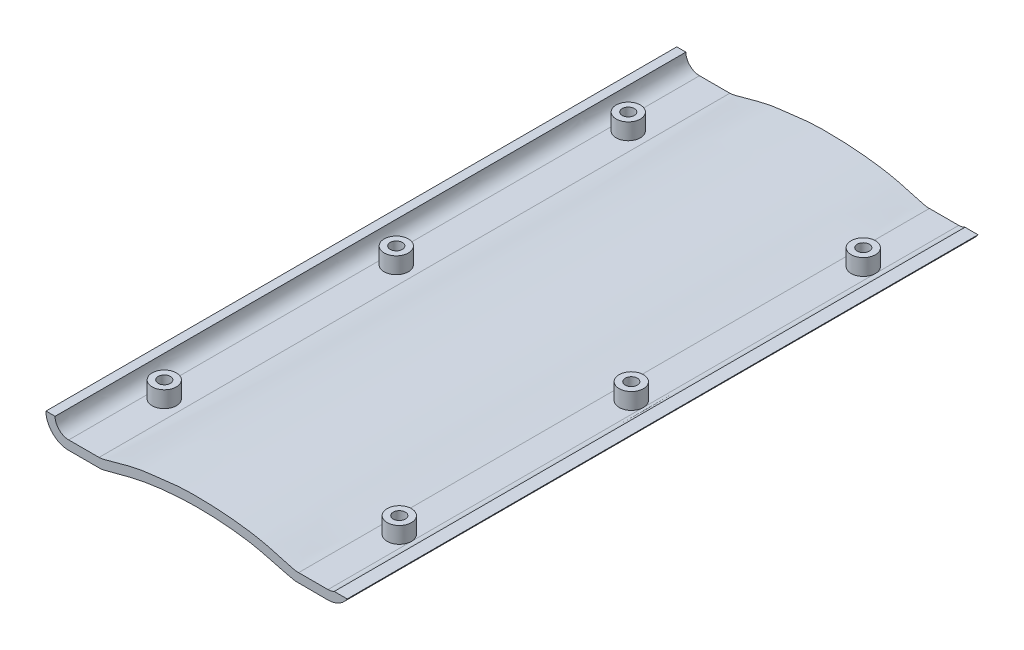
ISO-10303-21;
HEADER;
FILE_DESCRIPTION(('STEP AP214'),'2;1');
FILE_NAME('part.step','',(''),(''),'','','');
FILE_SCHEMA(('AUTOMOTIVE_DESIGN { 1 0 10303 214 1 1 1 1 }'));
ENDSEC;
DATA;
#1=APPLICATION_CONTEXT('core data for automotive mechanical design processes');
#2=APPLICATION_PROTOCOL_DEFINITION('international standard','automotive_design',2000,#1);
#3=PRODUCT_CONTEXT('',#1,'mechanical');
#4=PRODUCT('Part','Part','',(#3));
#5=PRODUCT_RELATED_PRODUCT_CATEGORY('part','',(#4));
#6=PRODUCT_DEFINITION_FORMATION('','',#4);
#7=PRODUCT_DEFINITION_CONTEXT('part definition',#1,'design');
#8=PRODUCT_DEFINITION('design','',#6,#7);
#9=PRODUCT_DEFINITION_SHAPE('','',#8);
#10=(LENGTH_UNIT() NAMED_UNIT(*) SI_UNIT(.MILLI.,.METRE.));
#11=(NAMED_UNIT(*) PLANE_ANGLE_UNIT() SI_UNIT($,.RADIAN.));
#12=(NAMED_UNIT(*) SI_UNIT($,.STERADIAN.) SOLID_ANGLE_UNIT());
#13=UNCERTAINTY_MEASURE_WITH_UNIT(LENGTH_MEASURE(1.E-05),#10,'distance_accuracy_value','');
#14=(GEOMETRIC_REPRESENTATION_CONTEXT(3) GLOBAL_UNCERTAINTY_ASSIGNED_CONTEXT((#13)) GLOBAL_UNIT_ASSIGNED_CONTEXT((#10,
#11,#12)) REPRESENTATION_CONTEXT('',''));
#15=CARTESIAN_POINT('',(0.,0.,0.));
#16=DIRECTION('',(0.,0.,1.));
#17=DIRECTION('',(1.,0.,0.));
#18=AXIS2_PLACEMENT_3D('',#15,#16,#17);
#19=CARTESIAN_POINT('',(31.7868567502551,38.1969713193044,104.));
#20=CARTESIAN_POINT('',(30.8156765561506,37.7005095783258,104.));
#21=CARTESIAN_POINT('',(29.7249650731608,37.6968942297724,104.));
#22=B_SPLINE_CURVE_WITH_KNOTS('',2,(#19,#20,#21),.UNSPECIFIED.,.F.,.F.,(3,3),(0.,1.),.UNSPECIFIED.);
#23=DIRECTION('',(0.,0.,-1.));
#24=VECTOR('',#23,1.);
#25=SURFACE_OF_LINEAR_EXTRUSION('',#22,#24);
#26=CARTESIAN_POINT('',(29.7249650731608,37.6968942297724,-76.0985447829219));
#27=CARTESIAN_POINT('',(29.7384295899145,37.6969670761466,-76.2323631886146));
#28=CARTESIAN_POINT('',(29.7451618482914,37.6970034993337,-76.3661815943073));
#29=CARTESIAN_POINT('',(29.7451618482914,37.6970034993337,-76.6338184056927));
#30=CARTESIAN_POINT('',(29.7384295899145,37.6969670761466,-76.7676368113854));
#31=CARTESIAN_POINT('',(29.7249650731608,37.6968942297724,-76.9014552170781));
#32=B_SPLINE_CURVE_WITH_KNOTS('',3,(#26,#27,#28,#29,#30,#31),.UNSPECIFIED.,.F.,.F.,(4,2,4),(0.,
0.401962949766164,0.803925899532329),.UNSPECIFIED.);
#33=CARTESIAN_POINT('',(29.7249650731608,37.6968942297724,-76.0985447829219));
#34=VERTEX_POINT('',#33);
#35=CARTESIAN_POINT('',(29.7249650731608,37.6968942297723,-76.9014552170781));
#36=VERTEX_POINT('',#35);
#37=EDGE_CURVE('E39',#34,#36,#32,.T.);
#38=ORIENTED_EDGE('',*,*,#37,.F.);
#39=DIRECTION('',(0.,0.,-1.));
#40=VECTOR('',#39,1.);
#41=CARTESIAN_POINT('',(29.7249650731608,37.6968942297723,104.));
#42=LINE('',#41,#40);
#43=CARTESIAN_POINT('',(29.7249650731608,37.6968942297723,-0.401455217078069));
#44=VERTEX_POINT('',#43);
#45=EDGE_CURVE('E68',#44,#34,#42,.T.);
#46=ORIENTED_EDGE('',*,*,#45,.F.);
#47=CARTESIAN_POINT('',(29.7249650731608,37.6968942297724,0.401455217078073));
#48=CARTESIAN_POINT('',(29.7384295899145,37.6969670761466,0.267636811385382));
#49=CARTESIAN_POINT('',(29.7451618482914,37.6970034993337,0.133818405692691));
#50=CARTESIAN_POINT('',(29.7451618482914,37.6970034993337,-0.133818405692691));
#51=CARTESIAN_POINT('',(29.7384295899145,37.6969670761466,-0.267636811385382));
#52=CARTESIAN_POINT('',(29.7249650731608,37.6968942297724,-0.401455217078073));
#53=B_SPLINE_CURVE_WITH_KNOTS('',3,(#47,#48,#49,#50,#51,#52),.UNSPECIFIED.,.F.,.F.,(4,2,4),(0.,
0.401962949766164,0.803925899532329),.UNSPECIFIED.);
#54=CARTESIAN_POINT('',(29.7249650731608,37.6968942297724,0.401455217078069));
#55=VERTEX_POINT('',#54);
#56=EDGE_CURVE('E430',#55,#44,#53,.T.);
#57=ORIENTED_EDGE('',*,*,#56,.F.);
#58=CARTESIAN_POINT('',(29.7249650731608,37.6968942297723,76.0985447829219));
#59=VERTEX_POINT('',#58);
#60=EDGE_CURVE('E72',#59,#55,#42,.T.);
#61=ORIENTED_EDGE('',*,*,#60,.F.);
#62=CARTESIAN_POINT('',(29.7249650731608,37.6968942297724,76.9014552170781));
#63=CARTESIAN_POINT('',(29.7384295899145,37.6969670761466,76.7676368113854));
#64=CARTESIAN_POINT('',(29.7451618482914,37.6970034993337,76.6338184056927));
#65=CARTESIAN_POINT('',(29.7451618482914,37.6970034993337,76.3661815943073));
#66=CARTESIAN_POINT('',(29.7384295899145,37.6969670761466,76.2323631886146));
#67=CARTESIAN_POINT('',(29.7249650731608,37.6968942297724,76.0985447829219));
#68=B_SPLINE_CURVE_WITH_KNOTS('',3,(#62,#63,#64,#65,#66,#67),.UNSPECIFIED.,.F.,.F.,(4,2,4),(0.,
0.401962949766164,0.803925899532329),.UNSPECIFIED.);
#69=CARTESIAN_POINT('',(29.7249650731608,37.6968942297724,76.9014552170781));
#70=VERTEX_POINT('',#69);
#71=EDGE_CURVE('E213',#70,#59,#68,.T.);
#72=ORIENTED_EDGE('',*,*,#71,.F.);
#73=CARTESIAN_POINT('',(29.7249650731608,37.6968942297723,104.));
#74=VERTEX_POINT('',#73);
#75=EDGE_CURVE('E79',#74,#70,#42,.T.);
#76=ORIENTED_EDGE('',*,*,#75,.F.);
#77=CARTESIAN_POINT('',(31.7868567502551,38.1969713193044,104.));
#78=VERTEX_POINT('',#77);
#79=EDGE_CURVE('E461',#78,#74,#22,.T.);
#80=ORIENTED_EDGE('',*,*,#79,.F.);
#81=DIRECTION('',(0.,0.,-1.));
#82=VECTOR('',#81,1.);
#83=CARTESIAN_POINT('',(31.7868567502551,38.1969713193044,104.));
#84=LINE('',#83,#82);
#85=CARTESIAN_POINT('',(31.7868567502551,38.1969713193044,-104.));
#86=VERTEX_POINT('',#85);
#87=EDGE_CURVE('E192',#78,#86,#84,.T.);
#88=ORIENTED_EDGE('',*,*,#87,.T.);
#89=CARTESIAN_POINT('',(31.7868567502551,38.1969713193044,-104.));
#90=CARTESIAN_POINT('',(30.8156765561506,37.7005095783258,-104.));
#91=CARTESIAN_POINT('',(29.7249650731608,37.6968942297724,-104.));
#92=B_SPLINE_CURVE_WITH_KNOTS('',2,(#89,#90,#91),.UNSPECIFIED.,.F.,.F.,(3,3),(0.,1.),.UNSPECIFIED.);
#93=CARTESIAN_POINT('',(29.7249650731608,37.6968942297723,-104.));
#94=VERTEX_POINT('',#93);
#95=EDGE_CURVE('E317',#86,#94,#92,.T.);
#96=ORIENTED_EDGE('',*,*,#95,.T.);
#97=EDGE_CURVE('E190',#36,#94,#42,.T.);
#98=ORIENTED_EDGE('',*,*,#97,.F.);
#99=EDGE_LOOP('',(#38,#46,#57,#61,#72,#76,#80,#88,#96,#98));
#100=FACE_BOUND('',#99,.T.);
#101=ADVANCED_FACE('F34',(#100),#25,.F.);
#102=CARTESIAN_POINT('',(-63.2548381517086,42.1968942285586,104.));
#103=CARTESIAN_POINT('',(-63.3682731197305,38.1655138912871,104.));
#104=CARTESIAN_POINT('',(-59.7511975840646,34.5967600730582,104.));
#105=CARTESIAN_POINT('',(-55.7548381518025,34.6968942297724,104.));
#106=B_SPLINE_CURVE_WITH_KNOTS('',3,(#102,#103,#104,#105),.UNSPECIFIED.,.F.,.F.,(4,4),(0.,1.),.UNSPECIFIED.);
#107=DIRECTION('',(0.,0.,-1.));
#108=VECTOR('',#107,1.);
#109=SURFACE_OF_LINEAR_EXTRUSION('',#106,#108);
#110=CARTESIAN_POINT('',(-63.2548381517086,42.1968942285586,-104.));
#111=CARTESIAN_POINT('',(-63.3682731197305,38.1655138912871,-104.));
#112=CARTESIAN_POINT('',(-59.7511975840646,34.5967600730582,-104.));
#113=CARTESIAN_POINT('',(-55.7548381518025,34.6968942297724,-104.));
#114=B_SPLINE_CURVE_WITH_KNOTS('',3,(#110,#111,#112,#113),.UNSPECIFIED.,.F.,.F.,(4,4),(0.,1.),.UNSPECIFIED.);
#115=CARTESIAN_POINT('',(-63.2548381517086,42.1968942285586,-104.));
#116=VERTEX_POINT('',#115);
#117=CARTESIAN_POINT('',(-55.7548381518025,34.6968942297724,-104.));
#118=VERTEX_POINT('',#117);
#119=EDGE_CURVE('E288',#116,#118,#114,.T.);
#120=ORIENTED_EDGE('',*,*,#119,.T.);
#121=DIRECTION('',(0.,0.,-1.));
#122=VECTOR('',#121,1.);
#123=CARTESIAN_POINT('',(-55.7548381518025,34.6968942297724,104.));
#124=LINE('',#123,#122);
#125=CARTESIAN_POINT('',(-55.7548381518025,34.6968942297724,104.));
#126=VERTEX_POINT('',#125);
#127=EDGE_CURVE('E207',#126,#118,#124,.T.);
#128=ORIENTED_EDGE('',*,*,#127,.F.);
#129=CARTESIAN_POINT('',(-63.2548381517086,42.1968942285586,104.));
#130=VERTEX_POINT('',#129);
#131=EDGE_CURVE('E345',#130,#126,#106,.T.);
#132=ORIENTED_EDGE('',*,*,#131,.F.);
#133=DIRECTION('',(0.,0.,-1.));
#134=VECTOR('',#133,1.);
#135=CARTESIAN_POINT('',(-63.2548381517086,42.1968942285586,104.));
#136=LINE('',#135,#134);
#137=EDGE_CURVE('E287',#130,#116,#136,.T.);
#138=ORIENTED_EDGE('',*,*,#137,.T.);
#139=EDGE_LOOP('',(#120,#128,#132,#138));
#140=FACE_BOUND('',#139,.T.);
#141=ADVANCED_FACE('F36',(#140),#109,.F.);
#142=CARTESIAN_POINT('',(-45.7548381517778,34.6968942297724,104.));
#143=DIRECTION('',(0.,1.,0.));
#144=DIRECTION('',(0.,0.,1.));
#145=AXIS2_PLACEMENT_3D('',#142,#143,#144);
#146=PLANE('',#145);
#147=CARTESIAN_POINT('',(-51.7548381517086,34.6968942297724,-76.5));
#148=DIRECTION('',(0.,1.,0.));
#149=DIRECTION('',(0.,0.,1.));
#150=AXIS2_PLACEMENT_3D('',#147,#148,#149);
#151=CIRCLE('',#150,2.);
#152=CARTESIAN_POINT('',(-51.7548381517086,34.6968942297724,-74.5));
#153=VERTEX_POINT('',#152);
#154=EDGE_CURVE('E540',#153,#153,#151,.T.);
#155=ORIENTED_EDGE('',*,*,#154,.T.);
#156=EDGE_LOOP('',(#155));
#157=FACE_BOUND('',#156,.T.);
#158=CARTESIAN_POINT('',(-51.7548381517086,34.6968942297724,0.));
#159=DIRECTION('',(0.,1.,0.));
#160=DIRECTION('',(0.,0.,1.));
#161=AXIS2_PLACEMENT_3D('',#158,#159,#160);
#162=CIRCLE('',#161,2.);
#163=CARTESIAN_POINT('',(-51.7548381517086,34.6968942297724,2.));
#164=VERTEX_POINT('',#163);
#165=EDGE_CURVE('E542',#164,#164,#162,.T.);
#166=ORIENTED_EDGE('',*,*,#165,.T.);
#167=EDGE_LOOP('',(#166));
#168=FACE_BOUND('',#167,.T.);
#169=CARTESIAN_POINT('',(-51.7548381517086,34.6968942297724,76.5));
#170=DIRECTION('',(0.,1.,0.));
#171=DIRECTION('',(0.,0.,1.));
#172=AXIS2_PLACEMENT_3D('',#169,#170,#171);
#173=CIRCLE('',#172,2.);
#174=CARTESIAN_POINT('',(-51.7548381517086,34.6968942297724,78.5));
#175=VERTEX_POINT('',#174);
#176=EDGE_CURVE('E547',#175,#175,#173,.T.);
#177=ORIENTED_EDGE('',*,*,#176,.T.);
#178=EDGE_LOOP('',(#177));
#179=FACE_BOUND('',#178,.T.);
#180=DIRECTION('',(1.,0.,0.));
#181=VECTOR('',#180,1.);
#182=CARTESIAN_POINT('',(-45.7548381517778,34.6968942297724,-104.));
#183=LINE('',#182,#181);
#184=CARTESIAN_POINT('',(-45.7548381517778,34.6968942297724,-104.));
#185=VERTEX_POINT('',#184);
#186=EDGE_CURVE('E293',#118,#185,#183,.T.);
#187=ORIENTED_EDGE('',*,*,#186,.T.);
#188=DIRECTION('',(0.,0.,-1.));
#189=VECTOR('',#188,1.);
#190=CARTESIAN_POINT('',(-45.7548381517778,34.6968942297724,104.));
#191=LINE('',#190,#189);
#192=CARTESIAN_POINT('',(-45.7548381517778,34.6968942297724,104.));
#193=VERTEX_POINT('',#192);
#194=EDGE_CURVE('E204',#193,#185,#191,.T.);
#195=ORIENTED_EDGE('',*,*,#194,.F.);
#196=DIRECTION('',(1.,0.,0.));
#197=VECTOR('',#196,1.);
#198=CARTESIAN_POINT('',(-45.7548381517778,34.6968942297724,104.));
#199=LINE('',#198,#197);
#200=EDGE_CURVE('E363',#126,#193,#199,.T.);
#201=ORIENTED_EDGE('',*,*,#200,.F.);
#202=ORIENTED_EDGE('',*,*,#127,.T.);
#203=EDGE_LOOP('',(#187,#195,#201,#202));
#204=FACE_BOUND('',#203,.T.);
#205=ADVANCED_FACE('F361',(#157,#168,#179,#204),#146,.F.);
#206=CARTESIAN_POINT('',(-45.7548381517778,34.6968942297724,104.));
#207=CARTESIAN_POINT('',(-44.6527947260766,34.6892445201621,104.));
#208=CARTESIAN_POINT('',(-41.8389101223905,35.4462593092921,104.));
#209=CARTESIAN_POINT('',(-36.7312855970934,36.8985012917322,104.));
#210=CARTESIAN_POINT('',(-30.3957952210604,38.3186380740379,104.));
#211=CARTESIAN_POINT('',(-22.2736868344942,39.3548223637903,104.));
#212=CARTESIAN_POINT('',(-13.0130739206246,39.8467470631081,104.));
#213=CARTESIAN_POINT('',(-3.43676950092065,39.320018707114,104.));
#214=CARTESIAN_POINT('',(7.29004413609731,37.9924631725361,104.));
#215=CARTESIAN_POINT('',(14.2379198839206,35.6752289256719,104.));
#216=CARTESIAN_POINT('',(18.8514683989212,34.7479343319048,104.));
#217=B_SPLINE_CURVE_WITH_KNOTS('',3,(#206,#207,#208,#209,#210,#211,#212,#213,#214,#215,#216),
.UNSPECIFIED.,.F.,.F.,(4,1,1,1,1,1,1,1,4),(0.,0.050080657421666,0.132344158491837,
0.243528070798206,0.346436055537385,0.506687838619731,0.666939621702403,0.784747440190989,1.),.UNSPECIFIED.);
#218=DIRECTION('',(0.,0.,-1.));
#219=VECTOR('',#218,1.);
#220=SURFACE_OF_LINEAR_EXTRUSION('',#217,#219);
#221=CARTESIAN_POINT('',(-45.7548381517778,34.6968942297724,-104.));
#222=CARTESIAN_POINT('',(-44.6527947260766,34.6892445201621,-104.));
#223=CARTESIAN_POINT('',(-41.8389101223905,35.4462593092921,-104.));
#224=CARTESIAN_POINT('',(-36.7312855970934,36.8985012917322,-104.));
#225=CARTESIAN_POINT('',(-30.3957952210604,38.3186380740379,-104.));
#226=CARTESIAN_POINT('',(-22.2736868344942,39.3548223637903,-104.));
#227=CARTESIAN_POINT('',(-13.0130739206246,39.8467470631081,-104.));
#228=CARTESIAN_POINT('',(-3.43676950092065,39.320018707114,-104.));
#229=CARTESIAN_POINT('',(7.29004413609731,37.9924631725361,-104.));
#230=CARTESIAN_POINT('',(14.2379198839206,35.6752289256719,-104.));
#231=CARTESIAN_POINT('',(18.8514683989212,34.7479343319048,-104.));
#232=B_SPLINE_CURVE_WITH_KNOTS('',3,(#221,#222,#223,#224,#225,#226,#227,#228,#229,#230,#231),
.UNSPECIFIED.,.F.,.F.,(4,1,1,1,1,1,1,1,4),(0.,0.050080657421666,0.132344158491837,
0.243528070798206,0.346436055537385,0.506687838619731,0.666939621702403,0.784747440190989,1.),.UNSPECIFIED.);
#233=CARTESIAN_POINT('',(18.8514683989212,34.7479343319048,-104.));
#234=VERTEX_POINT('',#233);
#235=EDGE_CURVE('E299',#185,#234,#232,.T.);
#236=ORIENTED_EDGE('',*,*,#235,.T.);
#237=DIRECTION('',(0.,0.,-1.));
#238=VECTOR('',#237,1.);
#239=CARTESIAN_POINT('',(18.8514683989212,34.7479343319048,104.));
#240=LINE('',#239,#238);
#241=CARTESIAN_POINT('',(18.8514683989212,34.7479343319048,104.));
#242=VERTEX_POINT('',#241);
#243=EDGE_CURVE('E201',#242,#234,#240,.T.);
#244=ORIENTED_EDGE('',*,*,#243,.F.);
#245=EDGE_CURVE('E365',#193,#242,#217,.T.);
#246=ORIENTED_EDGE('',*,*,#245,.F.);
#247=ORIENTED_EDGE('',*,*,#194,.T.);
#248=EDGE_LOOP('',(#236,#244,#246,#247));
#249=FACE_BOUND('',#248,.T.);
#250=ADVANCED_FACE('F387',(#249),#220,.F.);
#251=CARTESIAN_POINT('',(18.8514683989212,34.7479343319048,104.));
#252=DIRECTION('',(0.00469393993781579,0.999988983403247,0.));
#253=DIRECTION('',(-0.999988983403248,0.00469393993781579,0.));
#254=AXIS2_PLACEMENT_3D('',#251,#252,#253);
#255=PLANE('',#254);
#256=CARTESIAN_POINT('',(25.7451618482914,34.7155753924184,76.5));
#257=DIRECTION('',(0.00469393993781579,0.999988983403247,0.));
#258=DIRECTION('',(-0.999988983403248,0.00469393993781579,0.));
#259=AXIS2_PLACEMENT_3D('',#256,#257,#258);
#260=ELLIPSE('',#259,2.00002203343624,2.);
#261=CARTESIAN_POINT('',(23.7451618482914,34.7249633757176,76.5));
#262=VERTEX_POINT('',#261);
#263=EDGE_CURVE('E522',#262,#262,#260,.T.);
#264=ORIENTED_EDGE('',*,*,#263,.T.);
#265=EDGE_LOOP('',(#264));
#266=FACE_BOUND('',#265,.T.);
#267=CARTESIAN_POINT('',(25.7451618482914,34.7155753924184,0.));
#268=DIRECTION('',(0.00469393993781579,0.999988983403247,0.));
#269=DIRECTION('',(-0.999988983403248,0.00469393993781579,0.));
#270=AXIS2_PLACEMENT_3D('',#267,#268,#269);
#271=ELLIPSE('',#270,2.00002203343624,2.);
#272=CARTESIAN_POINT('',(23.7451618482914,34.7249633757176,0.));
#273=VERTEX_POINT('',#272);
#274=EDGE_CURVE('E526',#273,#273,#271,.T.);
#275=ORIENTED_EDGE('',*,*,#274,.T.);
#276=EDGE_LOOP('',(#275));
#277=FACE_BOUND('',#276,.T.);
#278=CARTESIAN_POINT('',(25.7451618482914,34.7155753924184,-76.5));
#279=DIRECTION('',(0.00469393993781579,0.999988983403247,0.));
#280=DIRECTION('',(-0.999988983403248,0.00469393993781579,0.));
#281=AXIS2_PLACEMENT_3D('',#278,#279,#280);
#282=ELLIPSE('',#281,2.00002203343624,2.);
#283=CARTESIAN_POINT('',(23.7451618482914,34.7249633757176,-76.5));
#284=VERTEX_POINT('',#283);
#285=EDGE_CURVE('E529',#284,#284,#282,.T.);
#286=ORIENTED_EDGE('',*,*,#285,.T.);
#287=EDGE_LOOP('',(#286));
#288=FACE_BOUND('',#287,.T.);
#289=DIRECTION('',(0.999988983403247,-0.00469393993781579,0.));
#290=VECTOR('',#289,1.);
#291=CARTESIAN_POINT('',(18.8514683989212,34.7479343319048,-104.));
#292=LINE('',#291,#290);
#293=CARTESIAN_POINT('',(29.7249650731217,34.6968942293138,-104.));
#294=VERTEX_POINT('',#293);
#295=EDGE_CURVE('E303',#234,#294,#292,.T.);
#296=ORIENTED_EDGE('',*,*,#295,.T.);
#297=DIRECTION('',(0.,0.,-1.));
#298=VECTOR('',#297,1.);
#299=CARTESIAN_POINT('',(29.7249650731217,34.6968942293138,104.));
#300=LINE('',#299,#298);
#301=CARTESIAN_POINT('',(29.7249650731217,34.6968942293138,104.));
#302=VERTEX_POINT('',#301);
#303=EDGE_CURVE('E198',#302,#294,#300,.T.);
#304=ORIENTED_EDGE('',*,*,#303,.F.);
#305=DIRECTION('',(0.999988983403247,-0.00469393993781579,0.));
#306=VECTOR('',#305,1.);
#307=CARTESIAN_POINT('',(18.8514683989212,34.7479343319048,104.));
#308=LINE('',#307,#306);
#309=EDGE_CURVE('E381',#242,#302,#308,.T.);
#310=ORIENTED_EDGE('',*,*,#309,.F.);
#311=ORIENTED_EDGE('',*,*,#243,.T.);
#312=EDGE_LOOP('',(#296,#304,#310,#311));
#313=FACE_BOUND('',#312,.T.);
#314=ADVANCED_FACE('F390',(#266,#277,#288,#313),#255,.F.);
#315=CARTESIAN_POINT('',(29.7249650731217,34.6968942293138,104.));
#316=CARTESIAN_POINT('',(33.7985090616984,34.8129686910056,104.));
#317=CARTESIAN_POINT('',(36.0692538430651,38.1968942288397,104.));
#318=B_SPLINE_CURVE_WITH_KNOTS('',2,(#315,#316,#317),.UNSPECIFIED.,.F.,.F.,(3,3),(0.,1.),.UNSPECIFIED.);
#319=DIRECTION('',(0.,0.,-1.));
#320=VECTOR('',#319,1.);
#321=SURFACE_OF_LINEAR_EXTRUSION('',#318,#320);
#322=CARTESIAN_POINT('',(29.7249650731217,34.6968942293138,-104.));
#323=CARTESIAN_POINT('',(33.7985090616984,34.8129686910056,-104.));
#324=CARTESIAN_POINT('',(36.0692538430651,38.1968942288397,-104.));
#325=B_SPLINE_CURVE_WITH_KNOTS('',2,(#322,#323,#324),.UNSPECIFIED.,.F.,.F.,(3,3),(0.,1.),.UNSPECIFIED.);
#326=CARTESIAN_POINT('',(36.0692538430651,38.1968942288397,-104.));
#327=VERTEX_POINT('',#326);
#328=EDGE_CURVE('E308',#294,#327,#325,.T.);
#329=ORIENTED_EDGE('',*,*,#328,.T.);
#330=DIRECTION('',(0.,0.,-1.));
#331=VECTOR('',#330,1.);
#332=CARTESIAN_POINT('',(36.0692538430651,38.1968942288397,104.));
#333=LINE('',#332,#331);
#334=CARTESIAN_POINT('',(36.0692538430651,38.1968942288397,104.));
#335=VERTEX_POINT('',#334);
#336=EDGE_CURVE('E195',#335,#327,#333,.T.);
#337=ORIENTED_EDGE('',*,*,#336,.F.);
#338=EDGE_CURVE('E484',#302,#335,#318,.T.);
#339=ORIENTED_EDGE('',*,*,#338,.F.);
#340=ORIENTED_EDGE('',*,*,#303,.T.);
#341=EDGE_LOOP('',(#329,#337,#339,#340));
#342=FACE_BOUND('',#341,.T.);
#343=ADVANCED_FACE('F478',(#342),#321,.F.);
#344=CARTESIAN_POINT('',(31.7868567502551,38.1969713193044,104.));
#345=DIRECTION('',(-1.80017086262916E-05,-0.999999999837969,0.));
#346=DIRECTION('',(0.999999999837969,-1.80017086262916E-05,0.));
#347=AXIS2_PLACEMENT_3D('',#344,#345,#346);
#348=PLANE('',#347);
#349=DIRECTION('',(-0.999999999837969,1.80017086262916E-05,0.));
#350=VECTOR('',#349,1.);
#351=CARTESIAN_POINT('',(31.7868567502551,38.1969713193044,-104.));
#352=LINE('',#351,#350);
#353=EDGE_CURVE('E312',#327,#86,#352,.T.);
#354=ORIENTED_EDGE('',*,*,#353,.T.);
#355=ORIENTED_EDGE('',*,*,#87,.F.);
#356=DIRECTION('',(-0.999999999837969,1.80017086262916E-05,0.));
#357=VECTOR('',#356,1.);
#358=CARTESIAN_POINT('',(31.7868567502551,38.1969713193044,104.));
#359=LINE('',#358,#357);
#360=EDGE_CURVE('E489',#335,#78,#359,.T.);
#361=ORIENTED_EDGE('',*,*,#360,.F.);
#362=ORIENTED_EDGE('',*,*,#336,.T.);
#363=EDGE_LOOP('',(#354,#355,#361,#362));
#364=FACE_BOUND('',#363,.T.);
#365=ADVANCED_FACE('F474',(#364),#348,.F.);
#366=CARTESIAN_POINT('',(20.0454876020881,37.6968942297724,104.));
#367=DIRECTION('',(0.,-1.,0.));
#368=DIRECTION('',(1.,0.,0.));
#369=AXIS2_PLACEMENT_3D('',#366,#367,#368);
#370=PLANE('',#369);
#371=CARTESIAN_POINT('',(25.7451618482914,37.6968942297724,-76.5));
#372=DIRECTION('',(0.,-1.,0.));
#373=DIRECTION('',(1.,0.,0.));
#374=AXIS2_PLACEMENT_3D('',#371,#372,#373);
#375=CIRCLE('',#374,4.00000000000001);
#376=EDGE_CURVE('E11',#36,#34,#375,.F.);
#377=ORIENTED_EDGE('',*,*,#376,.F.);
#378=ORIENTED_EDGE('',*,*,#97,.T.);
#379=DIRECTION('',(-1.,0.,0.));
#380=VECTOR('',#379,1.);
#381=CARTESIAN_POINT('',(20.0454876020881,37.6968942297724,-104.));
#382=LINE('',#381,#380);
#383=CARTESIAN_POINT('',(20.0454876020881,37.6968942297724,-104.));
#384=VERTEX_POINT('',#383);
#385=EDGE_CURVE('E322',#94,#384,#382,.T.);
#386=ORIENTED_EDGE('',*,*,#385,.T.);
#387=DIRECTION('',(0.,0.,-1.));
#388=VECTOR('',#387,1.);
#389=CARTESIAN_POINT('',(20.0454876020881,37.6968942297724,104.));
#390=LINE('',#389,#388);
#391=CARTESIAN_POINT('',(20.0454876020881,37.6968942297724,104.));
#392=VERTEX_POINT('',#391);
#393=EDGE_CURVE('E187',#392,#384,#390,.T.);
#394=ORIENTED_EDGE('',*,*,#393,.F.);
#395=DIRECTION('',(-1.,0.,0.));
#396=VECTOR('',#395,1.);
#397=CARTESIAN_POINT('',(20.0454876020881,37.6968942297724,104.));
#398=LINE('',#397,#396);
#399=EDGE_CURVE('E460',#74,#392,#398,.T.);
#400=ORIENTED_EDGE('',*,*,#399,.F.);
#401=ORIENTED_EDGE('',*,*,#75,.T.);
#402=CARTESIAN_POINT('',(25.7451618482914,37.6968942297724,76.5));
#403=DIRECTION('',(0.,-1.,0.));
#404=DIRECTION('',(1.,0.,0.));
#405=AXIS2_PLACEMENT_3D('',#402,#403,#404);
#406=CIRCLE('',#405,4.00000000000001);
#407=EDGE_CURVE('E210',#59,#70,#406,.F.);
#408=ORIENTED_EDGE('',*,*,#407,.F.);
#409=ORIENTED_EDGE('',*,*,#60,.T.);
#410=CARTESIAN_POINT('',(25.7451618482914,37.6968942297724,0.));
#411=DIRECTION('',(0.,-1.,0.));
#412=DIRECTION('',(1.,0.,0.));
#413=AXIS2_PLACEMENT_3D('',#410,#411,#412);
#414=CIRCLE('',#413,4.00000000000001);
#415=EDGE_CURVE('E49',#44,#55,#414,.F.);
#416=ORIENTED_EDGE('',*,*,#415,.F.);
#417=ORIENTED_EDGE('',*,*,#45,.T.);
#418=EDGE_LOOP('',(#377,#378,#386,#394,#400,#401,#408,#409,#416,#417));
#419=FACE_BOUND('',#418,.T.);
#420=ADVANCED_FACE('F471',(#419),#370,.F.);
#421=CARTESIAN_POINT('',(20.0454876020881,37.6968942297724,104.));
#422=CARTESIAN_POINT('',(19.0553045650656,37.6493341801087,104.));
#423=CARTESIAN_POINT('',(15.2004041481563,38.7535450685813,104.));
#424=CARTESIAN_POINT('',(7.93679317914412,40.8533032814167,104.));
#425=CARTESIAN_POINT('',(-2.21189010871769,42.2831605375038,104.));
#426=CARTESIAN_POINT('',(-11.8100639863647,42.7405965250677,104.));
#427=CARTESIAN_POINT('',(-19.5641250772315,42.6065813134134,104.));
#428=CARTESIAN_POINT('',(-26.104143006087,41.6819735095931,104.));
#429=CARTESIAN_POINT('',(-32.1886535682186,41.1201889220993,104.));
#430=CARTESIAN_POINT('',(-38.0801190788569,39.5949777732001,104.));
#431=CARTESIAN_POINT('',(-42.3864337637486,38.4333936368758,104.));
#432=CARTESIAN_POINT('',(-44.8754730514067,37.7074911107958,104.));
#433=CARTESIAN_POINT('',(-45.7548381517778,37.6968942297723,104.));
#434=B_SPLINE_CURVE_WITH_KNOTS('',3,(#421,#422,#423,#424,#425,#426,#427,#428,#429,#430,#431,
#432,#433),.UNSPECIFIED.,.F.,.F.,(4,1,1,1,1,1,1,1,1,1,4),(0.,0.0440439197286668,
0.17866014564488,0.340528583422333,0.502397021199794,0.610403313378869,0.688120170412493,
0.79899142055319,0.884347049909682,0.960747048147476,1.),.UNSPECIFIED.);
#435=DIRECTION('',(0.,0.,-1.));
#436=VECTOR('',#435,1.);
#437=SURFACE_OF_LINEAR_EXTRUSION('',#434,#436);
#438=CARTESIAN_POINT('',(20.0454876020881,37.6968942297724,-104.));
#439=CARTESIAN_POINT('',(19.0553045650656,37.6493341801087,-104.));
#440=CARTESIAN_POINT('',(15.2004041481563,38.7535450685813,-104.));
#441=CARTESIAN_POINT('',(7.93679317914412,40.8533032814167,-104.));
#442=CARTESIAN_POINT('',(-2.21189010871769,42.2831605375038,-104.));
#443=CARTESIAN_POINT('',(-11.8100639863647,42.7405965250677,-104.));
#444=CARTESIAN_POINT('',(-19.5641250772315,42.6065813134134,-104.));
#445=CARTESIAN_POINT('',(-26.104143006087,41.6819735095931,-104.));
#446=CARTESIAN_POINT('',(-32.1886535682186,41.1201889220993,-104.));
#447=CARTESIAN_POINT('',(-38.0801190788569,39.5949777732001,-104.));
#448=CARTESIAN_POINT('',(-42.3864337637486,38.4333936368758,-104.));
#449=CARTESIAN_POINT('',(-44.8754730514067,37.7074911107958,-104.));
#450=CARTESIAN_POINT('',(-45.7548381517778,37.6968942297723,-104.));
#451=B_SPLINE_CURVE_WITH_KNOTS('',3,(#438,#439,#440,#441,#442,#443,#444,#445,#446,#447,#448,
#449,#450),.UNSPECIFIED.,.F.,.F.,(4,1,1,1,1,1,1,1,1,1,4),(0.,0.0440439197286668,
0.17866014564488,0.340528583422333,0.502397021199794,0.610403313378869,0.688120170412493,
0.79899142055319,0.884347049909682,0.960747048147476,1.),.UNSPECIFIED.);
#452=CARTESIAN_POINT('',(-45.7548381517778,37.6968942297724,-104.));
#453=VERTEX_POINT('',#452);
#454=EDGE_CURVE('E327',#384,#453,#451,.T.);
#455=ORIENTED_EDGE('',*,*,#454,.T.);
#456=DIRECTION('',(0.,0.,-1.));
#457=VECTOR('',#456,1.);
#458=CARTESIAN_POINT('',(-45.7548381517778,37.6968942297724,104.));
#459=LINE('',#458,#457);
#460=CARTESIAN_POINT('',(-45.7548381517778,37.6968942297724,104.));
#461=VERTEX_POINT('',#460);
#462=EDGE_CURVE('E183',#461,#453,#459,.T.);
#463=ORIENTED_EDGE('',*,*,#462,.F.);
#464=EDGE_CURVE('E458',#392,#461,#434,.T.);
#465=ORIENTED_EDGE('',*,*,#464,.F.);
#466=ORIENTED_EDGE('',*,*,#393,.T.);
#467=EDGE_LOOP('',(#455,#463,#465,#466));
#468=FACE_BOUND('',#467,.T.);
#469=ADVANCED_FACE('F469',(#468),#437,.F.);
#470=CARTESIAN_POINT('',(-55.7548381517776,37.6968942297723,104.));
#471=DIRECTION('',(0.,-1.,0.));
#472=DIRECTION('',(1.,0.,0.));
#473=AXIS2_PLACEMENT_3D('',#470,#471,#472);
#474=PLANE('',#473);
#475=DIRECTION('',(0.,0.,-1.));
#476=VECTOR('',#475,1.);
#477=CARTESIAN_POINT('',(-55.7548381517776,37.6968942297723,104.));
#478=LINE('',#477,#476);
#479=CARTESIAN_POINT('',(-55.7548381517776,37.6968942297723,-76.5));
#480=VERTEX_POINT('',#479);
#481=CARTESIAN_POINT('',(-55.7548381517776,37.6968942297723,-104.));
#482=VERTEX_POINT('',#481);
#483=EDGE_CURVE('E179',#480,#482,#478,.T.);
#484=ORIENTED_EDGE('',*,*,#483,.F.);
#485=CARTESIAN_POINT('',(-51.7548381517086,37.6968942297724,-76.5));
#486=DIRECTION('',(0.,1.,0.));
#487=DIRECTION('',(-1.,0.,0.));
#488=AXIS2_PLACEMENT_3D('',#485,#486,#487);
#489=CIRCLE('',#488,4.00000000000001);
#490=EDGE_CURVE('E178',#480,#480,#489,.T.);
#491=ORIENTED_EDGE('',*,*,#490,.F.);
#492=CARTESIAN_POINT('',(-55.7548381517776,37.6968942297723,0.));
#493=VERTEX_POINT('',#492);
#494=EDGE_CURVE('E164',#493,#480,#478,.T.);
#495=ORIENTED_EDGE('',*,*,#494,.F.);
#496=CARTESIAN_POINT('',(-51.7548381517086,37.6968942297724,0.));
#497=DIRECTION('',(0.,1.,0.));
#498=DIRECTION('',(-1.,0.,0.));
#499=AXIS2_PLACEMENT_3D('',#496,#497,#498);
#500=CIRCLE('',#499,4.00000000000001);
#501=EDGE_CURVE('E176',#493,#493,#500,.T.);
#502=ORIENTED_EDGE('',*,*,#501,.F.);
#503=CARTESIAN_POINT('',(-55.7548381517776,37.6968942297723,76.5));
#504=VERTEX_POINT('',#503);
#505=EDGE_CURVE('E161',#504,#493,#478,.T.);
#506=ORIENTED_EDGE('',*,*,#505,.F.);
#507=CARTESIAN_POINT('',(-51.7548381517086,37.6968942297724,76.5));
#508=DIRECTION('',(0.,1.,0.));
#509=DIRECTION('',(-1.,0.,0.));
#510=AXIS2_PLACEMENT_3D('',#507,#508,#509);
#511=CIRCLE('',#510,4.00000000000001);
#512=EDGE_CURVE('E371',#504,#504,#511,.T.);
#513=ORIENTED_EDGE('',*,*,#512,.F.);
#514=CARTESIAN_POINT('',(-55.7548381517776,37.6968942297723,104.));
#515=VERTEX_POINT('',#514);
#516=EDGE_CURVE('E168',#515,#504,#478,.T.);
#517=ORIENTED_EDGE('',*,*,#516,.F.);
#518=DIRECTION('',(-1.,0.,0.));
#519=VECTOR('',#518,1.);
#520=CARTESIAN_POINT('',(-55.7548381517776,37.6968942297723,104.));
#521=LINE('',#520,#519);
#522=EDGE_CURVE('E281',#461,#515,#521,.T.);
#523=ORIENTED_EDGE('',*,*,#522,.F.);
#524=ORIENTED_EDGE('',*,*,#462,.T.);
#525=DIRECTION('',(-1.,0.,0.));
#526=VECTOR('',#525,1.);
#527=CARTESIAN_POINT('',(-55.7548381517776,37.6968942297723,-104.));
#528=LINE('',#527,#526);
#529=EDGE_CURVE('E331',#453,#482,#528,.T.);
#530=ORIENTED_EDGE('',*,*,#529,.T.);
#531=EDGE_LOOP('',(#484,#491,#495,#502,#506,#513,#517,#523,#524,#530));
#532=FACE_BOUND('',#531,.T.);
#533=ADVANCED_FACE('F174',(#532),#474,.F.);
#534=CARTESIAN_POINT('',(-55.7548381517776,37.6968942297723,104.));
#535=CARTESIAN_POINT('',(-58.1427158162828,37.6332895972156,104.));
#536=CARTESIAN_POINT('',(-60.3292649257792,39.7848627549881,104.));
#537=CARTESIAN_POINT('',(-60.254838151268,42.1968942285586,104.));
#538=B_SPLINE_CURVE_WITH_KNOTS('',3,(#534,#535,#536,#537),.UNSPECIFIED.,.F.,.F.,(4,4),(0.,1.),.UNSPECIFIED.);
#539=DIRECTION('',(0.,0.,-1.));
#540=VECTOR('',#539,1.);
#541=SURFACE_OF_LINEAR_EXTRUSION('',#538,#540);
#542=CARTESIAN_POINT('',(-55.7548381517776,37.6968942297723,-104.));
#543=CARTESIAN_POINT('',(-58.1427158162828,37.6332895972156,-104.));
#544=CARTESIAN_POINT('',(-60.3292649257792,39.7848627549881,-104.));
#545=CARTESIAN_POINT('',(-60.254838151268,42.1968942285586,-104.));
#546=B_SPLINE_CURVE_WITH_KNOTS('',3,(#542,#543,#544,#545),.UNSPECIFIED.,.F.,.F.,(4,4),(0.,1.),.UNSPECIFIED.);
#547=CARTESIAN_POINT('',(-60.254838151268,42.1968942285586,-104.));
#548=VERTEX_POINT('',#547);
#549=EDGE_CURVE('E337',#482,#548,#546,.T.);
#550=ORIENTED_EDGE('',*,*,#549,.T.);
#551=DIRECTION('',(0.,0.,-1.));
#552=VECTOR('',#551,1.);
#553=CARTESIAN_POINT('',(-60.254838151268,42.1968942285586,104.));
#554=LINE('',#553,#552);
#555=CARTESIAN_POINT('',(-60.254838151268,42.1968942285586,104.));
#556=VERTEX_POINT('',#555);
#557=EDGE_CURVE('E180',#556,#548,#554,.T.);
#558=ORIENTED_EDGE('',*,*,#557,.F.);
#559=EDGE_CURVE('E274',#515,#556,#538,.T.);
#560=ORIENTED_EDGE('',*,*,#559,.F.);
#561=ORIENTED_EDGE('',*,*,#516,.T.);
#562=ORIENTED_EDGE('',*,*,#505,.T.);
#563=ORIENTED_EDGE('',*,*,#494,.T.);
#564=ORIENTED_EDGE('',*,*,#483,.T.);
#565=EDGE_LOOP('',(#550,#558,#560,#561,#562,#563,#564));
#566=FACE_BOUND('',#565,.T.);
#567=ADVANCED_FACE('F163',(#566),#541,.F.);
#568=CARTESIAN_POINT('',(-63.2548381517086,42.1968942285586,104.));
#569=DIRECTION('',(0.,-1.,0.));
#570=DIRECTION('',(0.,0.,-1.));
#571=AXIS2_PLACEMENT_3D('',#568,#569,#570);
#572=PLANE('',#571);
#573=DIRECTION('',(-1.,0.,0.));
#574=VECTOR('',#573,1.);
#575=CARTESIAN_POINT('',(-63.2548381517086,42.1968942285586,-104.));
#576=LINE('',#575,#574);
#577=EDGE_CURVE('E341',#548,#116,#576,.T.);
#578=ORIENTED_EDGE('',*,*,#577,.T.);
#579=ORIENTED_EDGE('',*,*,#137,.F.);
#580=DIRECTION('',(-1.,0.,0.));
#581=VECTOR('',#580,1.);
#582=CARTESIAN_POINT('',(-63.2548381517086,42.1968942285586,104.));
#583=LINE('',#582,#581);
#584=EDGE_CURVE('E280',#556,#130,#583,.T.);
#585=ORIENTED_EDGE('',*,*,#584,.F.);
#586=ORIENTED_EDGE('',*,*,#557,.T.);
#587=EDGE_LOOP('',(#578,#579,#585,#586));
#588=FACE_BOUND('',#587,.T.);
#589=ADVANCED_FACE('F262',(#588),#572,.F.);
#590=CARTESIAN_POINT('',(-61.0460110518621,36.8975762939209,104.));
#591=DIRECTION('',(0.,0.,-1.));
#592=DIRECTION('',(-1.,0.,0.));
#593=AXIS2_PLACEMENT_3D('',#590,#591,#592);
#594=PLANE('',#593);
#595=ORIENTED_EDGE('',*,*,#131,.T.);
#596=ORIENTED_EDGE('',*,*,#200,.T.);
#597=ORIENTED_EDGE('',*,*,#245,.T.);
#598=ORIENTED_EDGE('',*,*,#309,.T.);
#599=ORIENTED_EDGE('',*,*,#338,.T.);
#600=ORIENTED_EDGE('',*,*,#360,.T.);
#601=ORIENTED_EDGE('',*,*,#79,.T.);
#602=ORIENTED_EDGE('',*,*,#399,.T.);
#603=ORIENTED_EDGE('',*,*,#464,.T.);
#604=ORIENTED_EDGE('',*,*,#522,.T.);
#605=ORIENTED_EDGE('',*,*,#559,.T.);
#606=ORIENTED_EDGE('',*,*,#584,.T.);
#607=EDGE_LOOP('',(#595,#596,#597,#598,#599,#600,#601,#602,#603,#604,#605,#606));
#608=FACE_BOUND('',#607,.T.);
#609=ADVANCED_FACE('F259',(#608),#594,.F.);
#610=CARTESIAN_POINT('',(-61.0460110518621,36.8975762939209,-104.));
#611=DIRECTION('',(0.,0.,-1.));
#612=DIRECTION('',(-1.,0.,0.));
#613=AXIS2_PLACEMENT_3D('',#610,#611,#612);
#614=PLANE('',#613);
#615=ORIENTED_EDGE('',*,*,#119,.F.);
#616=ORIENTED_EDGE('',*,*,#577,.F.);
#617=ORIENTED_EDGE('',*,*,#549,.F.);
#618=ORIENTED_EDGE('',*,*,#529,.F.);
#619=ORIENTED_EDGE('',*,*,#454,.F.);
#620=ORIENTED_EDGE('',*,*,#385,.F.);
#621=ORIENTED_EDGE('',*,*,#95,.F.);
#622=ORIENTED_EDGE('',*,*,#353,.F.);
#623=ORIENTED_EDGE('',*,*,#328,.F.);
#624=ORIENTED_EDGE('',*,*,#295,.F.);
#625=ORIENTED_EDGE('',*,*,#235,.F.);
#626=ORIENTED_EDGE('',*,*,#186,.F.);
#627=EDGE_LOOP('',(#615,#616,#617,#618,#619,#620,#621,#622,#623,#624,#625,#626));
#628=FACE_BOUND('',#627,.T.);
#629=ADVANCED_FACE('F257',(#628),#614,.T.);
#630=CARTESIAN_POINT('',(-51.7548381517086,43.0868942297724,76.5));
#631=DIRECTION('',(0.,-1.,0.));
#632=DIRECTION('',(1.,0.,0.));
#633=AXIS2_PLACEMENT_3D('',#630,#631,#632);
#634=CYLINDRICAL_SURFACE('',#633,4.00000000000001);
#635=CARTESIAN_POINT('',(-51.7548381517086,43.0868942297724,76.5));
#636=DIRECTION('',(0.,1.,0.));
#637=DIRECTION('',(-1.,0.,0.));
#638=AXIS2_PLACEMENT_3D('',#635,#636,#637);
#639=CIRCLE('',#638,4.00000000000001);
#640=CARTESIAN_POINT('',(-55.7548381517086,43.0868942297723,76.5));
#641=VERTEX_POINT('',#640);
#642=EDGE_CURVE('E294',#641,#641,#639,.T.);
#643=ORIENTED_EDGE('',*,*,#642,.F.);
#644=EDGE_LOOP('',(#643));
#645=FACE_BOUND('',#644,.T.);
#646=ORIENTED_EDGE('',*,*,#512,.T.);
#647=EDGE_LOOP('',(#646));
#648=FACE_BOUND('',#647,.T.);
#649=ADVANCED_FACE('F253',(#645,#648),#634,.T.);
#650=CARTESIAN_POINT('',(-51.7548381517086,43.0868942297724,76.5));
#651=DIRECTION('',(0.,1.,0.));
#652=DIRECTION('',(-1.,0.,0.));
#653=AXIS2_PLACEMENT_3D('',#650,#651,#652);
#654=PLANE('',#653);
#655=CARTESIAN_POINT('',(-51.7548381517086,43.0868942297724,76.5));
#656=DIRECTION('',(0.,1.,0.));
#657=DIRECTION('',(-1.,0.,0.));
#658=AXIS2_PLACEMENT_3D('',#655,#656,#657);
#659=CIRCLE('',#658,2.);
#660=CARTESIAN_POINT('',(-53.7548381517086,43.0868942297724,76.5));
#661=VERTEX_POINT('',#660);
#662=EDGE_CURVE('E545',#661,#661,#659,.T.);
#663=ORIENTED_EDGE('',*,*,#662,.F.);
#664=EDGE_LOOP('',(#663));
#665=FACE_BOUND('',#664,.T.);
#666=ORIENTED_EDGE('',*,*,#642,.T.);
#667=EDGE_LOOP('',(#666));
#668=FACE_BOUND('',#667,.T.);
#669=ADVANCED_FACE('F249',(#665,#668),#654,.T.);
#670=CARTESIAN_POINT('',(-51.7548381517086,43.0868942297724,0.));
#671=DIRECTION('',(0.,-1.,0.));
#672=DIRECTION('',(1.,0.,0.));
#673=AXIS2_PLACEMENT_3D('',#670,#671,#672);
#674=CYLINDRICAL_SURFACE('',#673,4.00000000000001);
#675=CARTESIAN_POINT('',(-51.7548381517086,43.0868942297724,0.));
#676=DIRECTION('',(0.,1.,0.));
#677=DIRECTION('',(-1.,0.,0.));
#678=AXIS2_PLACEMENT_3D('',#675,#676,#677);
#679=CIRCLE('',#678,4.00000000000001);
#680=CARTESIAN_POINT('',(-55.7548381517086,43.0868942297723,0.));
#681=VERTEX_POINT('',#680);
#682=EDGE_CURVE('E448',#681,#681,#679,.T.);
#683=ORIENTED_EDGE('',*,*,#682,.F.);
#684=EDGE_LOOP('',(#683));
#685=FACE_BOUND('',#684,.T.);
#686=ORIENTED_EDGE('',*,*,#501,.T.);
#687=EDGE_LOOP('',(#686));
#688=FACE_BOUND('',#687,.T.);
#689=ADVANCED_FACE('F245',(#685,#688),#674,.T.);
#690=CARTESIAN_POINT('',(-51.7548381517086,43.0868942297724,0.));
#691=DIRECTION('',(0.,1.,0.));
#692=DIRECTION('',(-1.,0.,0.));
#693=AXIS2_PLACEMENT_3D('',#690,#691,#692);
#694=PLANE('',#693);
#695=CARTESIAN_POINT('',(-51.7548381517086,43.0868942297724,0.));
#696=DIRECTION('',(0.,1.,0.));
#697=DIRECTION('',(-1.,0.,0.));
#698=AXIS2_PLACEMENT_3D('',#695,#696,#697);
#699=CIRCLE('',#698,2.);
#700=CARTESIAN_POINT('',(-53.7548381517086,43.0868942297724,0.));
#701=VERTEX_POINT('',#700);
#702=EDGE_CURVE('E531',#701,#701,#699,.T.);
#703=ORIENTED_EDGE('',*,*,#702,.F.);
#704=EDGE_LOOP('',(#703));
#705=FACE_BOUND('',#704,.T.);
#706=ORIENTED_EDGE('',*,*,#682,.T.);
#707=EDGE_LOOP('',(#706));
#708=FACE_BOUND('',#707,.T.);
#709=ADVANCED_FACE('F241',(#705,#708),#694,.T.);
#710=CARTESIAN_POINT('',(-51.7548381517086,43.0868942297724,-76.5));
#711=DIRECTION('',(0.,-1.,0.));
#712=DIRECTION('',(1.,0.,0.));
#713=AXIS2_PLACEMENT_3D('',#710,#711,#712);
#714=CYLINDRICAL_SURFACE('',#713,4.00000000000001);
#715=CARTESIAN_POINT('',(-51.7548381517086,43.0868942297724,-76.5));
#716=DIRECTION('',(0.,1.,0.));
#717=DIRECTION('',(-1.,0.,0.));
#718=AXIS2_PLACEMENT_3D('',#715,#716,#717);
#719=CIRCLE('',#718,4.00000000000001);
#720=CARTESIAN_POINT('',(-55.7548381517086,43.0868942297723,-76.5));
#721=VERTEX_POINT('',#720);
#722=EDGE_CURVE('E444',#721,#721,#719,.T.);
#723=ORIENTED_EDGE('',*,*,#722,.F.);
#724=EDGE_LOOP('',(#723));
#725=FACE_BOUND('',#724,.T.);
#726=ORIENTED_EDGE('',*,*,#490,.T.);
#727=EDGE_LOOP('',(#726));
#728=FACE_BOUND('',#727,.T.);
#729=ADVANCED_FACE('F237',(#725,#728),#714,.T.);
#730=CARTESIAN_POINT('',(-51.7548381517086,43.0868942297724,-76.5));
#731=DIRECTION('',(0.,1.,0.));
#732=DIRECTION('',(-1.,0.,0.));
#733=AXIS2_PLACEMENT_3D('',#730,#731,#732);
#734=PLANE('',#733);
#735=CARTESIAN_POINT('',(-51.7548381517086,43.0868942297724,-76.5));
#736=DIRECTION('',(0.,1.,0.));
#737=DIRECTION('',(-1.,0.,0.));
#738=AXIS2_PLACEMENT_3D('',#735,#736,#737);
#739=CIRCLE('',#738,2.);
#740=CARTESIAN_POINT('',(-53.7548381517086,43.0868942297724,-76.5));
#741=VERTEX_POINT('',#740);
#742=EDGE_CURVE('E535',#741,#741,#739,.T.);
#743=ORIENTED_EDGE('',*,*,#742,.F.);
#744=EDGE_LOOP('',(#743));
#745=FACE_BOUND('',#744,.T.);
#746=ORIENTED_EDGE('',*,*,#722,.T.);
#747=EDGE_LOOP('',(#746));
#748=FACE_BOUND('',#747,.T.);
#749=ADVANCED_FACE('F232',(#745,#748),#734,.T.);
#750=CARTESIAN_POINT('',(25.7451618482914,43.086894229773,76.5));
#751=DIRECTION('',(0.,-1.,0.));
#752=DIRECTION('',(1.,0.,0.));
#753=AXIS2_PLACEMENT_3D('',#750,#751,#752);
#754=CYLINDRICAL_SURFACE('',#753,4.00000000000001);
#755=CARTESIAN_POINT('',(25.7451618482914,43.086894229773,76.5));
#756=DIRECTION('',(0.,1.,0.));
#757=DIRECTION('',(-1.,0.,0.));
#758=AXIS2_PLACEMENT_3D('',#755,#756,#757);
#759=CIRCLE('',#758,4.00000000000001);
#760=CARTESIAN_POINT('',(21.7451618482914,43.086894229773,76.5));
#761=VERTEX_POINT('',#760);
#762=EDGE_CURVE('E220',#761,#761,#759,.T.);
#763=ORIENTED_EDGE('',*,*,#762,.F.);
#764=EDGE_LOOP('',(#763));
#765=FACE_BOUND('',#764,.T.);
#766=ORIENTED_EDGE('',*,*,#407,.T.);
#767=ORIENTED_EDGE('',*,*,#71,.T.);
#768=EDGE_LOOP('',(#766,#767));
#769=FACE_BOUND('',#768,.T.);
#770=ADVANCED_FACE('F226',(#765,#769),#754,.T.);
#771=CARTESIAN_POINT('',(25.7451618482914,43.086894229773,76.5));
#772=DIRECTION('',(0.,1.,0.));
#773=DIRECTION('',(-1.,0.,0.));
#774=AXIS2_PLACEMENT_3D('',#771,#772,#773);
#775=PLANE('',#774);
#776=CARTESIAN_POINT('',(25.7451618482914,43.086894229773,76.5));
#777=DIRECTION('',(0.,1.,0.));
#778=DIRECTION('',(-1.,0.,0.));
#779=AXIS2_PLACEMENT_3D('',#776,#777,#778);
#780=CIRCLE('',#779,2.);
#781=CARTESIAN_POINT('',(23.7451618482914,43.086894229773,76.5));
#782=VERTEX_POINT('',#781);
#783=EDGE_CURVE('E584',#782,#782,#780,.T.);
#784=ORIENTED_EDGE('',*,*,#783,.F.);
#785=EDGE_LOOP('',(#784));
#786=FACE_BOUND('',#785,.T.);
#787=ORIENTED_EDGE('',*,*,#762,.T.);
#788=EDGE_LOOP('',(#787));
#789=FACE_BOUND('',#788,.T.);
#790=ADVANCED_FACE('F231',(#786,#789),#775,.T.);
#791=CARTESIAN_POINT('',(25.7451618482914,43.086894229773,0.));
#792=DIRECTION('',(0.,-1.,0.));
#793=DIRECTION('',(1.,0.,0.));
#794=AXIS2_PLACEMENT_3D('',#791,#792,#793);
#795=CYLINDRICAL_SURFACE('',#794,4.00000000000001);
#796=CARTESIAN_POINT('',(25.7451618482914,43.086894229773,0.));
#797=DIRECTION('',(0.,1.,0.));
#798=DIRECTION('',(-1.,0.,0.));
#799=AXIS2_PLACEMENT_3D('',#796,#797,#798);
#800=CIRCLE('',#799,4.00000000000001);
#801=CARTESIAN_POINT('',(21.7451618482914,43.086894229773,0.));
#802=VERTEX_POINT('',#801);
#803=EDGE_CURVE('E407',#802,#802,#800,.T.);
#804=ORIENTED_EDGE('',*,*,#803,.F.);
#805=EDGE_LOOP('',(#804));
#806=FACE_BOUND('',#805,.T.);
#807=ORIENTED_EDGE('',*,*,#415,.T.);
#808=ORIENTED_EDGE('',*,*,#56,.T.);
#809=EDGE_LOOP('',(#807,#808));
#810=FACE_BOUND('',#809,.T.);
#811=ADVANCED_FACE('F421',(#806,#810),#795,.T.);
#812=CARTESIAN_POINT('',(25.7451618482914,43.086894229773,0.));
#813=DIRECTION('',(0.,1.,0.));
#814=DIRECTION('',(-1.,0.,0.));
#815=AXIS2_PLACEMENT_3D('',#812,#813,#814);
#816=PLANE('',#815);
#817=CARTESIAN_POINT('',(25.7451618482914,43.086894229773,0.));
#818=DIRECTION('',(0.,1.,0.));
#819=DIRECTION('',(-1.,0.,0.));
#820=AXIS2_PLACEMENT_3D('',#817,#818,#819);
#821=CIRCLE('',#820,2.);
#822=CARTESIAN_POINT('',(23.7451618482914,43.086894229773,0.));
#823=VERTEX_POINT('',#822);
#824=EDGE_CURVE('E583',#823,#823,#821,.T.);
#825=ORIENTED_EDGE('',*,*,#824,.F.);
#826=EDGE_LOOP('',(#825));
#827=FACE_BOUND('',#826,.T.);
#828=ORIENTED_EDGE('',*,*,#803,.T.);
#829=EDGE_LOOP('',(#828));
#830=FACE_BOUND('',#829,.T.);
#831=ADVANCED_FACE('F412',(#827,#830),#816,.T.);
#832=CARTESIAN_POINT('',(25.7451618482914,43.086894229773,-76.5));
#833=DIRECTION('',(0.,-1.,0.));
#834=DIRECTION('',(1.,0.,0.));
#835=AXIS2_PLACEMENT_3D('',#832,#833,#834);
#836=CYLINDRICAL_SURFACE('',#835,4.00000000000001);
#837=CARTESIAN_POINT('',(25.7451618482914,43.086894229773,-76.5));
#838=DIRECTION('',(0.,1.,0.));
#839=DIRECTION('',(-1.,0.,0.));
#840=AXIS2_PLACEMENT_3D('',#837,#838,#839);
#841=CIRCLE('',#840,4.00000000000001);
#842=CARTESIAN_POINT('',(21.7451618482914,43.086894229773,-76.5));
#843=VERTEX_POINT('',#842);
#844=EDGE_CURVE('E408',#843,#843,#841,.T.);
#845=ORIENTED_EDGE('',*,*,#844,.F.);
#846=EDGE_LOOP('',(#845));
#847=FACE_BOUND('',#846,.T.);
#848=ORIENTED_EDGE('',*,*,#376,.T.);
#849=ORIENTED_EDGE('',*,*,#37,.T.);
#850=EDGE_LOOP('',(#848,#849));
#851=FACE_BOUND('',#850,.T.);
#852=ADVANCED_FACE('F409',(#847,#851),#836,.T.);
#853=CARTESIAN_POINT('',(25.7451618482914,43.086894229773,-76.5));
#854=DIRECTION('',(0.,1.,0.));
#855=DIRECTION('',(-1.,0.,0.));
#856=AXIS2_PLACEMENT_3D('',#853,#854,#855);
#857=PLANE('',#856);
#858=CARTESIAN_POINT('',(25.7451618482914,43.086894229773,-76.5));
#859=DIRECTION('',(0.,1.,0.));
#860=DIRECTION('',(-1.,0.,0.));
#861=AXIS2_PLACEMENT_3D('',#858,#859,#860);
#862=CIRCLE('',#861,2.);
#863=CARTESIAN_POINT('',(23.7451618482914,43.086894229773,-76.5));
#864=VERTEX_POINT('',#863);
#865=EDGE_CURVE('E585',#864,#864,#862,.T.);
#866=ORIENTED_EDGE('',*,*,#865,.F.);
#867=EDGE_LOOP('',(#866));
#868=FACE_BOUND('',#867,.T.);
#869=ORIENTED_EDGE('',*,*,#844,.T.);
#870=EDGE_LOOP('',(#869));
#871=FACE_BOUND('',#870,.T.);
#872=ADVANCED_FACE('F411',(#868,#871),#857,.T.);
#873=CARTESIAN_POINT('',(-51.7548381517085,23.0868942297724,76.5));
#874=DIRECTION('',(0.,1.,0.));
#875=DIRECTION('',(-1.,0.,0.));
#876=AXIS2_PLACEMENT_3D('',#873,#874,#875);
#877=CYLINDRICAL_SURFACE('',#876,2.);
#878=ORIENTED_EDGE('',*,*,#662,.T.);
#879=EDGE_LOOP('',(#878));
#880=FACE_BOUND('',#879,.T.);
#881=ORIENTED_EDGE('',*,*,#176,.F.);
#882=EDGE_LOOP('',(#881));
#883=FACE_BOUND('',#882,.T.);
#884=ADVANCED_FACE('F418',(#880,#883),#877,.F.);
#885=CARTESIAN_POINT('',(25.7451618482915,23.086894229773,-76.5));
#886=DIRECTION('',(0.,1.,0.));
#887=DIRECTION('',(-1.,0.,0.));
#888=AXIS2_PLACEMENT_3D('',#885,#886,#887);
#889=CYLINDRICAL_SURFACE('',#888,2.);
#890=ORIENTED_EDGE('',*,*,#865,.T.);
#891=EDGE_LOOP('',(#890));
#892=FACE_BOUND('',#891,.T.);
#893=ORIENTED_EDGE('',*,*,#285,.F.);
#894=EDGE_LOOP('',(#893));
#895=FACE_BOUND('',#894,.T.);
#896=ADVANCED_FACE('F555',(#892,#895),#889,.F.);
#897=CARTESIAN_POINT('',(25.7451618482915,23.086894229773,0.));
#898=DIRECTION('',(0.,1.,0.));
#899=DIRECTION('',(-1.,0.,0.));
#900=AXIS2_PLACEMENT_3D('',#897,#898,#899);
#901=CYLINDRICAL_SURFACE('',#900,2.);
#902=ORIENTED_EDGE('',*,*,#824,.T.);
#903=EDGE_LOOP('',(#902));
#904=FACE_BOUND('',#903,.T.);
#905=ORIENTED_EDGE('',*,*,#274,.F.);
#906=EDGE_LOOP('',(#905));
#907=FACE_BOUND('',#906,.T.);
#908=ADVANCED_FACE('F560',(#904,#907),#901,.F.);
#909=CARTESIAN_POINT('',(25.7451618482915,23.086894229773,76.5));
#910=DIRECTION('',(0.,1.,0.));
#911=DIRECTION('',(-1.,0.,0.));
#912=AXIS2_PLACEMENT_3D('',#909,#910,#911);
#913=CYLINDRICAL_SURFACE('',#912,2.);
#914=ORIENTED_EDGE('',*,*,#783,.T.);
#915=EDGE_LOOP('',(#914));
#916=FACE_BOUND('',#915,.T.);
#917=ORIENTED_EDGE('',*,*,#263,.F.);
#918=EDGE_LOOP('',(#917));
#919=FACE_BOUND('',#918,.T.);
#920=ADVANCED_FACE('F569',(#916,#919),#913,.F.);
#921=CARTESIAN_POINT('',(-51.7548381517085,23.0868942297724,-76.5));
#922=DIRECTION('',(0.,1.,0.));
#923=DIRECTION('',(-1.,0.,0.));
#924=AXIS2_PLACEMENT_3D('',#921,#922,#923);
#925=CYLINDRICAL_SURFACE('',#924,2.);
#926=ORIENTED_EDGE('',*,*,#742,.T.);
#927=EDGE_LOOP('',(#926));
#928=FACE_BOUND('',#927,.T.);
#929=ORIENTED_EDGE('',*,*,#154,.F.);
#930=EDGE_LOOP('',(#929));
#931=FACE_BOUND('',#930,.T.);
#932=ADVANCED_FACE('F567',(#928,#931),#925,.F.);
#933=CARTESIAN_POINT('',(-51.7548381517085,23.0868942297724,0.));
#934=DIRECTION('',(0.,1.,0.));
#935=DIRECTION('',(-1.,0.,0.));
#936=AXIS2_PLACEMENT_3D('',#933,#934,#935);
#937=CYLINDRICAL_SURFACE('',#936,2.);
#938=ORIENTED_EDGE('',*,*,#702,.T.);
#939=EDGE_LOOP('',(#938));
#940=FACE_BOUND('',#939,.T.);
#941=ORIENTED_EDGE('',*,*,#165,.F.);
#942=EDGE_LOOP('',(#941));
#943=FACE_BOUND('',#942,.T.);
#944=ADVANCED_FACE('F564',(#940,#943),#937,.F.);
#945=CLOSED_SHELL('',(#101,#141,#205,#250,#314,#343,#365,#420,#469,#533,#567,#589,#609,#629,
#649,#669,#689,#709,#729,#749,#770,#790,#811,#831,#852,#872,#884,#896,#908,#920,#932,#944));
#946=MANIFOLD_SOLID_BREP('B2',#945);
#947=ADVANCED_BREP_SHAPE_REPRESENTATION('',(#18,#946),#14);
#948=SHAPE_DEFINITION_REPRESENTATION(#9,#947);
ENDSEC;
END-ISO-10303-21;
